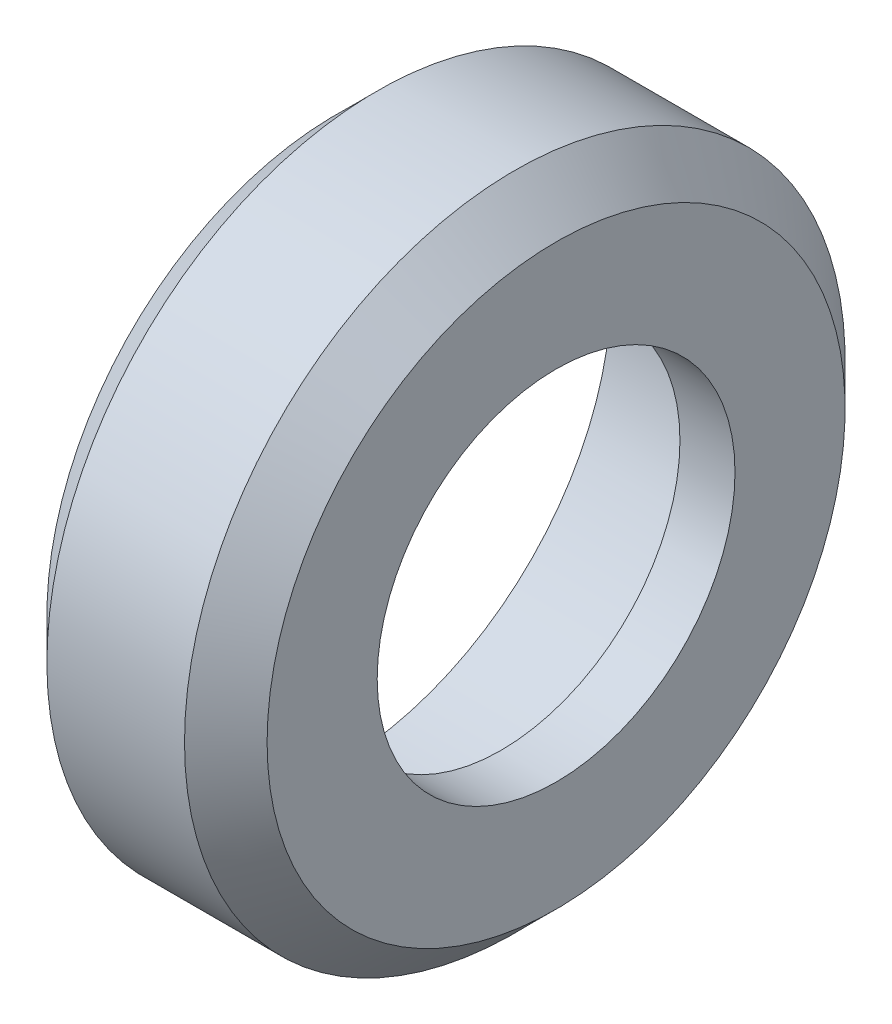
ISO-10303-21;
HEADER;
FILE_DESCRIPTION(('STEP AP214'),'2;1');
FILE_NAME('part.step','',(''),(''),'','','');
FILE_SCHEMA(('AUTOMOTIVE_DESIGN { 1 0 10303 214 1 1 1 1 }'));
ENDSEC;
DATA;
#1=APPLICATION_CONTEXT('core data for automotive mechanical design processes');
#2=APPLICATION_PROTOCOL_DEFINITION('international standard','automotive_design',2000,#1);
#3=PRODUCT_CONTEXT('',#1,'mechanical');
#4=PRODUCT('Part','Part','',(#3));
#5=PRODUCT_RELATED_PRODUCT_CATEGORY('part','',(#4));
#6=PRODUCT_DEFINITION_FORMATION('','',#4);
#7=PRODUCT_DEFINITION_CONTEXT('part definition',#1,'design');
#8=PRODUCT_DEFINITION('design','',#6,#7);
#9=PRODUCT_DEFINITION_SHAPE('','',#8);
#10=(LENGTH_UNIT() NAMED_UNIT(*) SI_UNIT(.MILLI.,.METRE.));
#11=(NAMED_UNIT(*) PLANE_ANGLE_UNIT() SI_UNIT($,.RADIAN.));
#12=(NAMED_UNIT(*) SI_UNIT($,.STERADIAN.) SOLID_ANGLE_UNIT());
#13=UNCERTAINTY_MEASURE_WITH_UNIT(LENGTH_MEASURE(1.E-05),#10,'distance_accuracy_value','');
#14=(GEOMETRIC_REPRESENTATION_CONTEXT(3) GLOBAL_UNCERTAINTY_ASSIGNED_CONTEXT((#13)) GLOBAL_UNIT_ASSIGNED_CONTEXT((#10,
#11,#12)) REPRESENTATION_CONTEXT('',''));
#15=CARTESIAN_POINT('',(0.,0.,0.));
#16=DIRECTION('',(0.,0.,1.));
#17=DIRECTION('',(1.,0.,0.));
#18=AXIS2_PLACEMENT_3D('',#15,#16,#17);
#19=CARTESIAN_POINT('',(4.,-4.645866583732,-29.332847180016));
#20=DIRECTION('',(1.,0.,0.));
#21=DIRECTION('',(0.,0.809016994374948,0.587785252292473));
#22=AXIS2_PLACEMENT_3D('',#19,#20,#21);
#23=PLANE('',#22);
#24=CARTESIAN_POINT('',(4.,0.,0.));
#25=DIRECTION('',(-1.,0.,0.));
#26=DIRECTION('',(0.,0.,1.));
#27=AXIS2_PLACEMENT_3D('',#24,#25,#26);
#28=CIRCLE('',#27,12.9999999999998);
#29=CARTESIAN_POINT('',(4.,0.,12.9999999999998));
#30=VERTEX_POINT('',#29);
#31=EDGE_CURVE('E48',#30,#30,#28,.F.);
#32=ORIENTED_EDGE('',*,*,#31,.F.);
#33=EDGE_LOOP('',(#32));
#34=FACE_BOUND('',#33,.T.);
#35=CARTESIAN_POINT('',(4.,0.,0.));
#36=DIRECTION('',(-1.,0.,0.));
#37=DIRECTION('',(0.,0.,1.));
#38=AXIS2_PLACEMENT_3D('',#35,#36,#37);
#39=CIRCLE('',#38,21.0000000000001);
#40=CARTESIAN_POINT('',(4.,0.,21.0000000000001));
#41=VERTEX_POINT('',#40);
#42=EDGE_CURVE('E51',#41,#41,#39,.F.);
#43=ORIENTED_EDGE('',*,*,#42,.T.);
#44=EDGE_LOOP('',(#43));
#45=FACE_BOUND('',#44,.T.);
#46=ADVANCED_FACE('F14',(#34,#45),#23,.T.);
#47=CARTESIAN_POINT('',(4.,0.,0.));
#48=DIRECTION('',(-1.,0.,0.));
#49=DIRECTION('',(0.,0.,1.));
#50=AXIS2_PLACEMENT_3D('',#47,#48,#49);
#51=CONICAL_SURFACE('',#50,21.0000000000001,0.785398163397429);
#52=ORIENTED_EDGE('',*,*,#42,.F.);
#53=EDGE_LOOP('',(#52));
#54=FACE_BOUND('',#53,.T.);
#55=CARTESIAN_POINT('',(1.,0.,0.));
#56=DIRECTION('',(-1.,0.,0.));
#57=DIRECTION('',(0.,0.809016994374958,0.587785252292458));
#58=AXIS2_PLACEMENT_3D('',#55,#56,#57);
#59=CIRCLE('',#58,24.);
#60=CARTESIAN_POINT('',(1.,19.416407864999,14.106846055019));
#61=VERTEX_POINT('',#60);
#62=EDGE_CURVE('E45',#61,#61,#59,.F.);
#63=ORIENTED_EDGE('',*,*,#62,.T.);
#64=EDGE_LOOP('',(#63));
#65=FACE_BOUND('',#64,.T.);
#66=ADVANCED_FACE('F57',(#54,#65),#51,.T.);
#67=CARTESIAN_POINT('',(4.,0.,0.));
#68=DIRECTION('',(-1.,0.,0.));
#69=DIRECTION('',(0.,0.,1.));
#70=AXIS2_PLACEMENT_3D('',#67,#68,#69);
#71=CYLINDRICAL_SURFACE('',#70,12.9999999999998);
#72=CARTESIAN_POINT('',(0.,0.,0.));
#73=DIRECTION('',(-1.,0.,0.));
#74=DIRECTION('',(0.,0.,1.));
#75=AXIS2_PLACEMENT_3D('',#72,#73,#74);
#76=CIRCLE('',#75,12.9999999999998);
#77=CARTESIAN_POINT('',(0.,0.,12.9999999999998));
#78=VERTEX_POINT('',#77);
#79=EDGE_CURVE('E42',#78,#78,#76,.F.);
#80=ORIENTED_EDGE('',*,*,#79,.F.);
#81=EDGE_LOOP('',(#80));
#82=FACE_BOUND('',#81,.T.);
#83=ORIENTED_EDGE('',*,*,#31,.T.);
#84=EDGE_LOOP('',(#83));
#85=FACE_BOUND('',#84,.T.);
#86=ADVANCED_FACE('F60',(#82,#85),#71,.F.);
#87=CARTESIAN_POINT('',(1.,0.,0.));
#88=DIRECTION('',(-1.,0.,0.));
#89=DIRECTION('',(0.,0.,1.));
#90=AXIS2_PLACEMENT_3D('',#87,#88,#89);
#91=CYLINDRICAL_SURFACE('',#90,24.);
#92=ORIENTED_EDGE('',*,*,#62,.F.);
#93=EDGE_LOOP('',(#92));
#94=FACE_BOUND('',#93,.T.);
#95=CARTESIAN_POINT('',(-9.,0.,0.));
#96=DIRECTION('',(-1.,0.,0.));
#97=DIRECTION('',(0.,0.809016994374958,0.587785252292458));
#98=AXIS2_PLACEMENT_3D('',#95,#96,#97);
#99=CIRCLE('',#98,24.);
#100=CARTESIAN_POINT('',(-9.,19.416407864999,14.106846055019));
#101=VERTEX_POINT('',#100);
#102=EDGE_CURVE('E39',#101,#101,#99,.F.);
#103=ORIENTED_EDGE('',*,*,#102,.T.);
#104=EDGE_LOOP('',(#103));
#105=FACE_BOUND('',#104,.T.);
#106=ADVANCED_FACE('F71',(#94,#105),#91,.T.);
#107=CARTESIAN_POINT('',(0.,-27.936044933348,4.4246348416495));
#108=DIRECTION('',(-1.,0.,0.));
#109=DIRECTION('',(0.,0.809016994374949,0.587785252292471));
#110=AXIS2_PLACEMENT_3D('',#107,#108,#109);
#111=PLANE('',#110);
#112=ORIENTED_EDGE('',*,*,#79,.T.);
#113=EDGE_LOOP('',(#112));
#114=FACE_BOUND('',#113,.T.);
#115=CARTESIAN_POINT('',(0.,0.,0.));
#116=DIRECTION('',(-1.,0.,0.));
#117=DIRECTION('',(0.,0.,1.));
#118=AXIS2_PLACEMENT_3D('',#115,#116,#117);
#119=CIRCLE('',#118,19.9999999999998);
#120=CARTESIAN_POINT('',(0.,0.,19.9999999999998));
#121=VERTEX_POINT('',#120);
#122=EDGE_CURVE('E27',#121,#121,#119,.F.);
#123=ORIENTED_EDGE('',*,*,#122,.F.);
#124=EDGE_LOOP('',(#123));
#125=FACE_BOUND('',#124,.T.);
#126=ADVANCED_FACE('F77',(#114,#125),#111,.T.);
#127=CARTESIAN_POINT('',(-9.,0.,0.));
#128=DIRECTION('',(1.,0.,0.));
#129=DIRECTION('',(0.,0.,-1.));
#130=AXIS2_PLACEMENT_3D('',#127,#128,#129);
#131=CONICAL_SURFACE('',#130,24.,0.785398163397429);
#132=ORIENTED_EDGE('',*,*,#102,.F.);
#133=EDGE_LOOP('',(#132));
#134=FACE_BOUND('',#133,.T.);
#135=CARTESIAN_POINT('',(-12.,0.,0.));
#136=DIRECTION('',(1.,0.,0.));
#137=DIRECTION('',(0.,0.,-1.));
#138=AXIS2_PLACEMENT_3D('',#135,#136,#137);
#139=CIRCLE('',#138,21.0000000000001);
#140=CARTESIAN_POINT('',(-12.,0.,-21.0000000000001));
#141=VERTEX_POINT('',#140);
#142=EDGE_CURVE('E22',#141,#141,#139,.F.);
#143=ORIENTED_EDGE('',*,*,#142,.F.);
#144=EDGE_LOOP('',(#143));
#145=FACE_BOUND('',#144,.T.);
#146=ADVANCED_FACE('F73',(#134,#145),#131,.T.);
#147=CARTESIAN_POINT('',(0.,0.,0.));
#148=DIRECTION('',(-1.,0.,0.));
#149=DIRECTION('',(0.,0.,1.));
#150=AXIS2_PLACEMENT_3D('',#147,#148,#149);
#151=CYLINDRICAL_SURFACE('',#150,19.9999999999998);
#152=CARTESIAN_POINT('',(-12.,0.,0.));
#153=DIRECTION('',(-1.,0.,0.));
#154=DIRECTION('',(0.,0.,1.));
#155=AXIS2_PLACEMENT_3D('',#152,#153,#154);
#156=CIRCLE('',#155,19.9999999999998);
#157=CARTESIAN_POINT('',(-12.,0.,19.9999999999998));
#158=VERTEX_POINT('',#157);
#159=EDGE_CURVE('E10',#158,#158,#156,.F.);
#160=ORIENTED_EDGE('',*,*,#159,.F.);
#161=EDGE_LOOP('',(#160));
#162=FACE_BOUND('',#161,.T.);
#163=ORIENTED_EDGE('',*,*,#122,.T.);
#164=EDGE_LOOP('',(#163));
#165=FACE_BOUND('',#164,.T.);
#166=ADVANCED_FACE('F76',(#162,#165),#151,.F.);
#167=CARTESIAN_POINT('',(-12.,-29.332847180016,4.645866583732));
#168=DIRECTION('',(-1.,0.,0.));
#169=DIRECTION('',(0.,0.809016994374948,0.587785252292473));
#170=AXIS2_PLACEMENT_3D('',#167,#168,#169);
#171=PLANE('',#170);
#172=ORIENTED_EDGE('',*,*,#159,.T.);
#173=EDGE_LOOP('',(#172));
#174=FACE_BOUND('',#173,.T.);
#175=ORIENTED_EDGE('',*,*,#142,.T.);
#176=EDGE_LOOP('',(#175));
#177=FACE_BOUND('',#176,.T.);
#178=ADVANCED_FACE('F16',(#174,#177),#171,.T.);
#179=CLOSED_SHELL('',(#46,#66,#86,#106,#126,#146,#166,#178));
#180=MANIFOLD_SOLID_BREP('B1',#179);
#181=ADVANCED_BREP_SHAPE_REPRESENTATION('',(#18,#180),#14);
#182=SHAPE_DEFINITION_REPRESENTATION(#9,#181);
ENDSEC;
END-ISO-10303-21;
